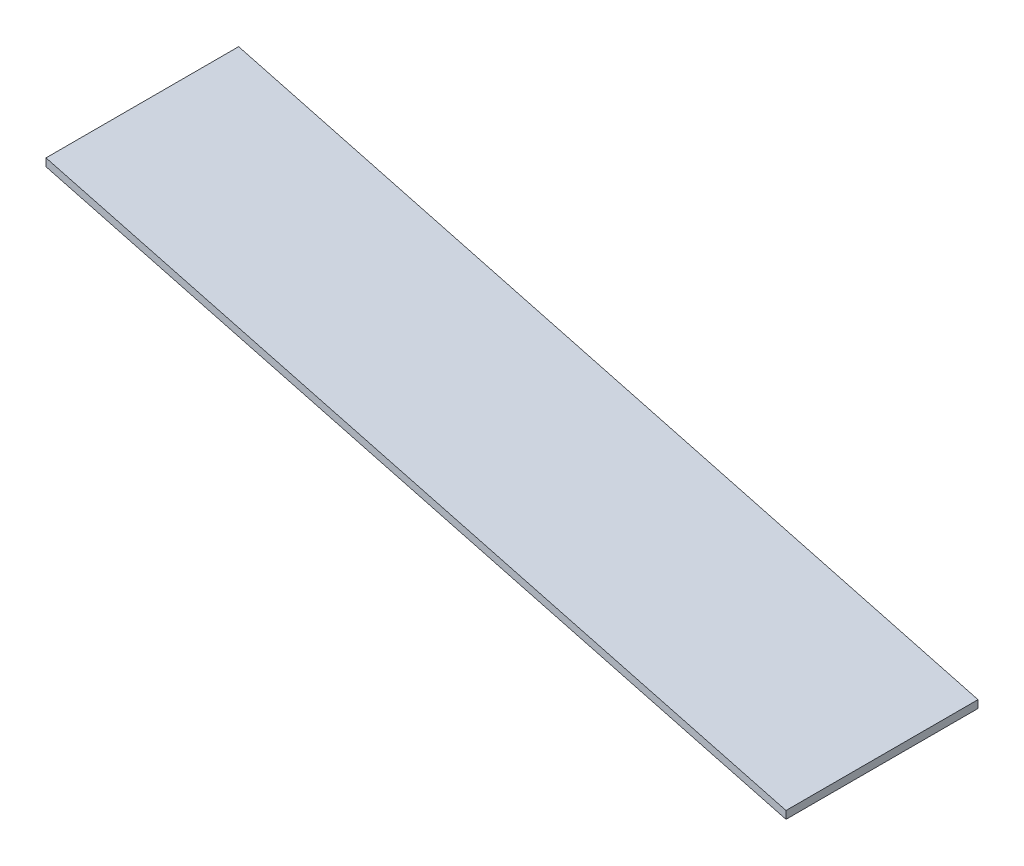
ISO-10303-21;
HEADER;
FILE_DESCRIPTION(('STEP AP214'),'2;1');
FILE_NAME('part.step','',(''),(''),'','','');
FILE_SCHEMA(('AUTOMOTIVE_DESIGN { 1 0 10303 214 1 1 1 1 }'));
ENDSEC;
DATA;
#1=APPLICATION_CONTEXT('core data for automotive mechanical design processes');
#2=APPLICATION_PROTOCOL_DEFINITION('international standard','automotive_design',2000,#1);
#3=PRODUCT_CONTEXT('',#1,'mechanical');
#4=PRODUCT('Part','Part','',(#3));
#5=PRODUCT_RELATED_PRODUCT_CATEGORY('part','',(#4));
#6=PRODUCT_DEFINITION_FORMATION('','',#4);
#7=PRODUCT_DEFINITION_CONTEXT('part definition',#1,'design');
#8=PRODUCT_DEFINITION('design','',#6,#7);
#9=PRODUCT_DEFINITION_SHAPE('','',#8);
#10=(LENGTH_UNIT() NAMED_UNIT(*) SI_UNIT(.MILLI.,.METRE.));
#11=(NAMED_UNIT(*) PLANE_ANGLE_UNIT() SI_UNIT($,.RADIAN.));
#12=(NAMED_UNIT(*) SI_UNIT($,.STERADIAN.) SOLID_ANGLE_UNIT());
#13=UNCERTAINTY_MEASURE_WITH_UNIT(LENGTH_MEASURE(1.E-05),#10,'distance_accuracy_value','');
#14=(GEOMETRIC_REPRESENTATION_CONTEXT(3) GLOBAL_UNCERTAINTY_ASSIGNED_CONTEXT((#13)) GLOBAL_UNIT_ASSIGNED_CONTEXT((#10,
#11,#12)) REPRESENTATION_CONTEXT('',''));
#15=CARTESIAN_POINT('',(0.,0.,0.));
#16=DIRECTION('',(0.,0.,1.));
#17=DIRECTION('',(1.,0.,0.));
#18=AXIS2_PLACEMENT_3D('',#15,#16,#17);
#19=CARTESIAN_POINT('',(-8.631267976045,2.15,0.));
#20=DIRECTION('',(0.,1.,0.));
#21=DIRECTION('',(0.,0.,1.));
#22=AXIS2_PLACEMENT_3D('',#19,#20,#21);
#23=PLANE('',#22);
#24=DIRECTION('',(-0.978769926750404,0.,-0.204962022065085));
#25=VECTOR('',#24,1.);
#26=CARTESIAN_POINT('',(-8.652213579657,2.15,0.100023051617));
#27=LINE('',#26,#25);
#28=CARTESIAN_POINT('',(2.39420949214311,2.15,2.41322980992146));
#29=VERTEX_POINT('',#28);
#30=CARTESIAN_POINT('',(1.17843449335812,2.15,2.15863708560843));
#31=VERTEX_POINT('',#30);
#32=EDGE_CURVE('E79',#29,#31,#27,.T.);
#33=ORIENTED_EDGE('',*,*,#32,.F.);
#34=DIRECTION('',(0.,0.,-1.));
#35=VECTOR('',#34,1.);
#36=CARTESIAN_POINT('',(2.394209492143,2.15,0.));
#37=LINE('',#36,#35);
#38=CARTESIAN_POINT('',(2.39420949214328,2.15,2.66282714248464));
#39=VERTEX_POINT('',#38);
#40=EDGE_CURVE('E55',#39,#29,#37,.T.);
#41=ORIENTED_EDGE('',*,*,#40,.F.);
#42=DIRECTION('',(0.978908819698662,0.,0.20429763267393));
#43=VECTOR('',#42,1.);
#44=CARTESIAN_POINT('',(-8.703627343349,2.15,0.346715827853));
#45=LINE('',#44,#43);
#46=CARTESIAN_POINT('',(1.17843449335825,2.15,2.4090956926108));
#47=VERTEX_POINT('',#46);
#48=EDGE_CURVE('E57',#47,#39,#45,.T.);
#49=ORIENTED_EDGE('',*,*,#48,.F.);
#50=DIRECTION('',(0.,0.,1.));
#51=VECTOR('',#50,1.);
#52=CARTESIAN_POINT('',(1.178434493358,2.15,0.));
#53=LINE('',#52,#51);
#54=EDGE_CURVE('E20',#31,#47,#53,.T.);
#55=ORIENTED_EDGE('',*,*,#54,.F.);
#56=EDGE_LOOP('',(#33,#41,#49,#55));
#57=FACE_BOUND('',#56,.T.);
#58=ADVANCED_FACE('F17',(#57),#23,.F.);
#59=CARTESIAN_POINT('',(1.178434493358,2.16,0.));
#60=DIRECTION('',(-1.,0.,0.));
#61=DIRECTION('',(0.,0.,1.));
#62=AXIS2_PLACEMENT_3D('',#59,#60,#61);
#63=PLANE('',#62);
#64=DIRECTION('',(0.,0.,1.));
#65=VECTOR('',#64,1.);
#66=CARTESIAN_POINT('',(1.178434493358,2.16,0.));
#67=LINE('',#66,#65);
#68=CARTESIAN_POINT('',(1.17843449335812,2.16,2.15863708560843));
#69=VERTEX_POINT('',#68);
#70=CARTESIAN_POINT('',(1.17843449335825,2.16,2.4090956926108));
#71=VERTEX_POINT('',#70);
#72=EDGE_CURVE('E83',#69,#71,#67,.T.);
#73=ORIENTED_EDGE('',*,*,#72,.F.);
#74=DIRECTION('',(0.,1.,0.));
#75=VECTOR('',#74,1.);
#76=CARTESIAN_POINT('',(1.17843449335848,2.16,2.15863708560673));
#77=LINE('',#76,#75);
#78=EDGE_CURVE('E68',#31,#69,#77,.T.);
#79=ORIENTED_EDGE('',*,*,#78,.F.);
#80=ORIENTED_EDGE('',*,*,#54,.T.);
#81=DIRECTION('',(0.,1.,0.));
#82=VECTOR('',#81,1.);
#83=CARTESIAN_POINT('',(1.178434493359,2.16,2.40909569260721));
#84=LINE('',#83,#82);
#85=EDGE_CURVE('E63',#71,#47,#84,.F.);
#86=ORIENTED_EDGE('',*,*,#85,.F.);
#87=EDGE_LOOP('',(#73,#79,#80,#86));
#88=FACE_BOUND('',#87,.T.);
#89=ADVANCED_FACE('F65',(#88),#63,.T.);
#90=CARTESIAN_POINT('',(-8.703627343349,2.16,0.346715827853));
#91=DIRECTION('',(-0.20429763267393,0.,0.978908819698662));
#92=DIRECTION('',(0.978908819698662,0.,0.20429763267393));
#93=AXIS2_PLACEMENT_3D('',#90,#91,#92);
#94=PLANE('',#93);
#95=DIRECTION('',(0.978908819698553,0.,0.204297632674452));
#96=VECTOR('',#95,1.);
#97=CARTESIAN_POINT('',(1.178434493358,2.16,2.409095692612));
#98=LINE('',#97,#96);
#99=CARTESIAN_POINT('',(2.39420949214357,2.16,2.66282714248328));
#100=VERTEX_POINT('',#99);
#101=EDGE_CURVE('E72',#71,#100,#98,.T.);
#102=ORIENTED_EDGE('',*,*,#101,.F.);
#103=ORIENTED_EDGE('',*,*,#85,.T.);
#104=ORIENTED_EDGE('',*,*,#48,.T.);
#105=DIRECTION('',(0.,1.,0.));
#106=VECTOR('',#105,1.);
#107=CARTESIAN_POINT('',(2.394209492143,2.16,2.662827142486));
#108=LINE('',#107,#106);
#109=EDGE_CURVE('E75',#100,#39,#108,.F.);
#110=ORIENTED_EDGE('',*,*,#109,.F.);
#111=EDGE_LOOP('',(#102,#103,#104,#110));
#112=FACE_BOUND('',#111,.T.);
#113=ADVANCED_FACE('F70',(#112),#94,.T.);
#114=CARTESIAN_POINT('',(2.394209492143,2.16,0.));
#115=DIRECTION('',(1.,0.,0.));
#116=DIRECTION('',(0.,0.,-1.));
#117=AXIS2_PLACEMENT_3D('',#114,#115,#116);
#118=PLANE('',#117);
#119=DIRECTION('',(0.,0.,1.));
#120=VECTOR('',#119,1.);
#121=CARTESIAN_POINT('',(2.394209492143,2.16,0.));
#122=LINE('',#121,#120);
#123=CARTESIAN_POINT('',(2.39420949214311,2.16,2.41322980992146));
#124=VERTEX_POINT('',#123);
#125=EDGE_CURVE('E26',#100,#124,#122,.F.);
#126=ORIENTED_EDGE('',*,*,#125,.F.);
#127=ORIENTED_EDGE('',*,*,#109,.T.);
#128=ORIENTED_EDGE('',*,*,#40,.T.);
#129=DIRECTION('',(0.,1.,0.));
#130=VECTOR('',#129,1.);
#131=CARTESIAN_POINT('',(2.39420949214345,2.16,2.41322980991985));
#132=LINE('',#131,#130);
#133=EDGE_CURVE('E35',#124,#29,#132,.F.);
#134=ORIENTED_EDGE('',*,*,#133,.F.);
#135=EDGE_LOOP('',(#126,#127,#128,#134));
#136=FACE_BOUND('',#135,.T.);
#137=ADVANCED_FACE('F89',(#136),#118,.T.);
#138=CARTESIAN_POINT('',(-8.652213579657,2.16,0.100023051617));
#139=DIRECTION('',(0.204962022065085,0.,-0.978769926750404));
#140=DIRECTION('',(-0.978769926750404,0.,-0.204962022065085));
#141=AXIS2_PLACEMENT_3D('',#138,#139,#140);
#142=PLANE('',#141);
#143=DIRECTION('',(-0.978769926750426,0.,-0.204962022064983));
#144=VECTOR('',#143,1.);
#145=CARTESIAN_POINT('',(2.394209492143,2.16,2.413229809922));
#146=LINE('',#145,#144);
#147=EDGE_CURVE('E11',#124,#69,#146,.T.);
#148=ORIENTED_EDGE('',*,*,#147,.F.);
#149=ORIENTED_EDGE('',*,*,#133,.T.);
#150=ORIENTED_EDGE('',*,*,#32,.T.);
#151=ORIENTED_EDGE('',*,*,#78,.T.);
#152=EDGE_LOOP('',(#148,#149,#150,#151));
#153=FACE_BOUND('',#152,.T.);
#154=ADVANCED_FACE('F91',(#153),#142,.T.);
#155=CARTESIAN_POINT('',(-8.631267976045,2.16,0.));
#156=DIRECTION('',(0.,1.,0.));
#157=DIRECTION('',(0.,0.,1.));
#158=AXIS2_PLACEMENT_3D('',#155,#156,#157);
#159=PLANE('',#158);
#160=ORIENTED_EDGE('',*,*,#125,.T.);
#161=ORIENTED_EDGE('',*,*,#147,.T.);
#162=ORIENTED_EDGE('',*,*,#72,.T.);
#163=ORIENTED_EDGE('',*,*,#101,.T.);
#164=EDGE_LOOP('',(#160,#161,#162,#163));
#165=FACE_BOUND('',#164,.T.);
#166=ADVANCED_FACE('F88',(#165),#159,.T.);
#167=CLOSED_SHELL('',(#58,#89,#113,#137,#154,#166));
#168=MANIFOLD_SOLID_BREP('B1',#167);
#169=ADVANCED_BREP_SHAPE_REPRESENTATION('',(#18,#168),#14);
#170=SHAPE_DEFINITION_REPRESENTATION(#9,#169);
ENDSEC;
END-ISO-10303-21;
